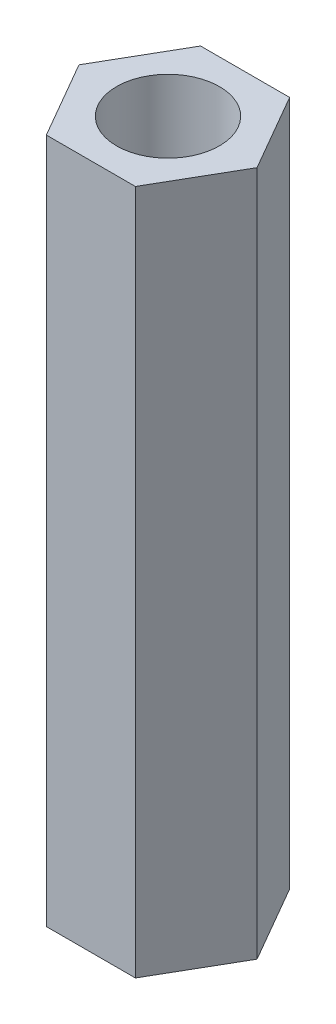
ISO-10303-21;
HEADER;
FILE_DESCRIPTION(('STEP AP214'),'2;1');
FILE_NAME('part.step','',(''),(''),'','','');
FILE_SCHEMA(('AUTOMOTIVE_DESIGN { 1 0 10303 214 1 1 1 1 }'));
ENDSEC;
DATA;
#1=APPLICATION_CONTEXT('core data for automotive mechanical design processes');
#2=APPLICATION_PROTOCOL_DEFINITION('international standard','automotive_design',2000,#1);
#3=PRODUCT_CONTEXT('',#1,'mechanical');
#4=PRODUCT('Part','Part','',(#3));
#5=PRODUCT_RELATED_PRODUCT_CATEGORY('part','',(#4));
#6=PRODUCT_DEFINITION_FORMATION('','',#4);
#7=PRODUCT_DEFINITION_CONTEXT('part definition',#1,'design');
#8=PRODUCT_DEFINITION('design','',#6,#7);
#9=PRODUCT_DEFINITION_SHAPE('','',#8);
#10=(LENGTH_UNIT() NAMED_UNIT(*) SI_UNIT(.MILLI.,.METRE.));
#11=(NAMED_UNIT(*) PLANE_ANGLE_UNIT() SI_UNIT($,.RADIAN.));
#12=(NAMED_UNIT(*) SI_UNIT($,.STERADIAN.) SOLID_ANGLE_UNIT());
#13=UNCERTAINTY_MEASURE_WITH_UNIT(LENGTH_MEASURE(1.E-05),#10,'distance_accuracy_value','');
#14=(GEOMETRIC_REPRESENTATION_CONTEXT(3) GLOBAL_UNCERTAINTY_ASSIGNED_CONTEXT((#13)) GLOBAL_UNIT_ASSIGNED_CONTEXT((#10,
#11,#12)) REPRESENTATION_CONTEXT('',''));
#15=CARTESIAN_POINT('',(0.,0.,0.));
#16=DIRECTION('',(0.,0.,1.));
#17=DIRECTION('',(1.,0.,0.));
#18=AXIS2_PLACEMENT_3D('',#15,#16,#17);
#19=CARTESIAN_POINT('',(0.,20.,0.));
#20=DIRECTION('',(0.,1.,0.));
#21=DIRECTION('',(0.,0.,1.));
#22=AXIS2_PLACEMENT_3D('',#19,#20,#21);
#23=PLANE('',#22);
#24=DIRECTION('',(0.499999999999999,0.,-0.866025403784439));
#25=VECTOR('',#24,1.);
#26=CARTESIAN_POINT('',(1.29903810567665,20.,2.25000000000002));
#27=LINE('',#26,#25);
#28=CARTESIAN_POINT('',(1.29903810567665,20.,2.25000000000002));
#29=VERTEX_POINT('',#28);
#30=CARTESIAN_POINT('',(2.59807621135332,20.,0.));
#31=VERTEX_POINT('',#30);
#32=EDGE_CURVE('E128',#29,#31,#27,.T.);
#33=ORIENTED_EDGE('',*,*,#32,.T.);
#34=DIRECTION('',(-0.5,0.,-0.866025403784438));
#35=VECTOR('',#34,1.);
#36=CARTESIAN_POINT('',(2.59807621135332,20.,0.));
#37=LINE('',#36,#35);
#38=CARTESIAN_POINT('',(1.29903810567665,20.,-2.25000000000002));
#39=VERTEX_POINT('',#38);
#40=EDGE_CURVE('E86',#31,#39,#37,.T.);
#41=ORIENTED_EDGE('',*,*,#40,.T.);
#42=DIRECTION('',(-1.,0.,0.));
#43=VECTOR('',#42,1.);
#44=CARTESIAN_POINT('',(1.29903810567665,20.,-2.25000000000002));
#45=LINE('',#44,#43);
#46=CARTESIAN_POINT('',(-1.29903810567667,20.,-2.25000000000002));
#47=VERTEX_POINT('',#46);
#48=EDGE_CURVE('E99',#39,#47,#45,.T.);
#49=ORIENTED_EDGE('',*,*,#48,.T.);
#50=DIRECTION('',(-0.5,0.,0.866025403784439));
#51=VECTOR('',#50,1.);
#52=CARTESIAN_POINT('',(-1.29903810567667,20.,-2.25000000000002));
#53=LINE('',#52,#51);
#54=CARTESIAN_POINT('',(-2.59807621135334,20.,0.));
#55=VERTEX_POINT('',#54);
#56=EDGE_CURVE('E93',#47,#55,#53,.T.);
#57=ORIENTED_EDGE('',*,*,#56,.T.);
#58=DIRECTION('',(0.5,0.,0.866025403784439));
#59=VECTOR('',#58,1.);
#60=CARTESIAN_POINT('',(-2.59807621135334,20.,0.));
#61=LINE('',#60,#59);
#62=CARTESIAN_POINT('',(-1.29903810567667,20.,2.25000000000002));
#63=VERTEX_POINT('',#62);
#64=EDGE_CURVE('E97',#55,#63,#61,.T.);
#65=ORIENTED_EDGE('',*,*,#64,.T.);
#66=DIRECTION('',(1.,0.,0.));
#67=VECTOR('',#66,1.);
#68=CARTESIAN_POINT('',(-1.29903810567667,20.,2.25000000000002));
#69=LINE('',#68,#67);
#70=EDGE_CURVE('E49',#63,#29,#69,.T.);
#71=ORIENTED_EDGE('',*,*,#70,.T.);
#72=EDGE_LOOP('',(#33,#41,#49,#57,#65,#71));
#73=FACE_BOUND('',#72,.T.);
#74=CARTESIAN_POINT('',(0.,20.,0.));
#75=DIRECTION('',(0.,1.,0.));
#76=DIRECTION('',(0.,0.,1.));
#77=AXIS2_PLACEMENT_3D('',#74,#75,#76);
#78=CIRCLE('',#77,1.5);
#79=CARTESIAN_POINT('',(0.,20.,1.5));
#80=VERTEX_POINT('',#79);
#81=EDGE_CURVE('E121',#80,#80,#78,.T.);
#82=ORIENTED_EDGE('',*,*,#81,.F.);
#83=EDGE_LOOP('',(#82));
#84=FACE_BOUND('',#83,.T.);
#85=ADVANCED_FACE('F32',(#73,#84),#23,.T.);
#86=CARTESIAN_POINT('',(0.,0.,0.));
#87=DIRECTION('',(0.,1.,0.));
#88=DIRECTION('',(0.,0.,1.));
#89=AXIS2_PLACEMENT_3D('',#86,#87,#88);
#90=PLANE('',#89);
#91=DIRECTION('',(0.499999999999999,0.,-0.866025403784439));
#92=VECTOR('',#91,1.);
#93=CARTESIAN_POINT('',(1.29903810567665,0.,2.25000000000002));
#94=LINE('',#93,#92);
#95=CARTESIAN_POINT('',(1.29903810567665,0.,2.25000000000002));
#96=VERTEX_POINT('',#95);
#97=CARTESIAN_POINT('',(2.59807621135332,0.,0.));
#98=VERTEX_POINT('',#97);
#99=EDGE_CURVE('E117',#96,#98,#94,.T.);
#100=ORIENTED_EDGE('',*,*,#99,.F.);
#101=DIRECTION('',(1.,0.,0.));
#102=VECTOR('',#101,1.);
#103=CARTESIAN_POINT('',(-1.29903810567667,0.,2.25000000000002));
#104=LINE('',#103,#102);
#105=CARTESIAN_POINT('',(-1.29903810567667,0.,2.25000000000002));
#106=VERTEX_POINT('',#105);
#107=EDGE_CURVE('E78',#106,#96,#104,.T.);
#108=ORIENTED_EDGE('',*,*,#107,.F.);
#109=DIRECTION('',(0.5,0.,0.866025403784439));
#110=VECTOR('',#109,1.);
#111=CARTESIAN_POINT('',(-2.59807621135334,0.,0.));
#112=LINE('',#111,#110);
#113=CARTESIAN_POINT('',(-2.59807621135334,0.,0.));
#114=VERTEX_POINT('',#113);
#115=EDGE_CURVE('E72',#114,#106,#112,.T.);
#116=ORIENTED_EDGE('',*,*,#115,.F.);
#117=DIRECTION('',(-0.5,0.,0.866025403784439));
#118=VECTOR('',#117,1.);
#119=CARTESIAN_POINT('',(-1.29903810567667,0.,-2.25000000000002));
#120=LINE('',#119,#118);
#121=CARTESIAN_POINT('',(-1.29903810567667,0.,-2.25000000000002));
#122=VERTEX_POINT('',#121);
#123=EDGE_CURVE('E107',#122,#114,#120,.T.);
#124=ORIENTED_EDGE('',*,*,#123,.F.);
#125=DIRECTION('',(-1.,0.,0.));
#126=VECTOR('',#125,1.);
#127=CARTESIAN_POINT('',(1.29903810567665,0.,-2.25000000000002));
#128=LINE('',#127,#126);
#129=CARTESIAN_POINT('',(1.29903810567665,0.,-2.25000000000002));
#130=VERTEX_POINT('',#129);
#131=EDGE_CURVE('E123',#130,#122,#128,.T.);
#132=ORIENTED_EDGE('',*,*,#131,.F.);
#133=DIRECTION('',(-0.5,0.,-0.866025403784438));
#134=VECTOR('',#133,1.);
#135=CARTESIAN_POINT('',(2.59807621135332,0.,0.));
#136=LINE('',#135,#134);
#137=EDGE_CURVE('E120',#98,#130,#136,.T.);
#138=ORIENTED_EDGE('',*,*,#137,.F.);
#139=EDGE_LOOP('',(#100,#108,#116,#124,#132,#138));
#140=FACE_BOUND('',#139,.T.);
#141=CARTESIAN_POINT('',(0.,0.,0.));
#142=DIRECTION('',(0.,1.,0.));
#143=DIRECTION('',(0.,0.,1.));
#144=AXIS2_PLACEMENT_3D('',#141,#142,#143);
#145=CIRCLE('',#144,1.5);
#146=CARTESIAN_POINT('',(0.,0.,1.5));
#147=VERTEX_POINT('',#146);
#148=EDGE_CURVE('E221',#147,#147,#145,.T.);
#149=ORIENTED_EDGE('',*,*,#148,.T.);
#150=EDGE_LOOP('',(#149));
#151=FACE_BOUND('',#150,.T.);
#152=ADVANCED_FACE('F137',(#140,#151),#90,.F.);
#153=CARTESIAN_POINT('',(1.29903810567665,20.,2.25000000000002));
#154=DIRECTION('',(-0.866025403784439,0.,-0.499999999999999));
#155=DIRECTION('',(-0.499999999999999,0.,0.866025403784439));
#156=AXIS2_PLACEMENT_3D('',#153,#154,#155);
#157=PLANE('',#156);
#158=ORIENTED_EDGE('',*,*,#99,.T.);
#159=DIRECTION('',(0.,-1.,0.));
#160=VECTOR('',#159,1.);
#161=CARTESIAN_POINT('',(2.59807621135332,20.,0.));
#162=LINE('',#161,#160);
#163=EDGE_CURVE('E11',#31,#98,#162,.T.);
#164=ORIENTED_EDGE('',*,*,#163,.F.);
#165=ORIENTED_EDGE('',*,*,#32,.F.);
#166=DIRECTION('',(0.,-1.,0.));
#167=VECTOR('',#166,1.);
#168=CARTESIAN_POINT('',(1.29903810567665,20.,2.25000000000002));
#169=LINE('',#168,#167);
#170=EDGE_CURVE('E113',#29,#96,#169,.T.);
#171=ORIENTED_EDGE('',*,*,#170,.T.);
#172=EDGE_LOOP('',(#158,#164,#165,#171));
#173=FACE_BOUND('',#172,.T.);
#174=ADVANCED_FACE('F34',(#173),#157,.F.);
#175=CARTESIAN_POINT('',(2.59807621135332,20.,0.));
#176=DIRECTION('',(-0.866025403784438,0.,0.5));
#177=DIRECTION('',(0.5,0.,0.866025403784438));
#178=AXIS2_PLACEMENT_3D('',#175,#176,#177);
#179=PLANE('',#178);
#180=ORIENTED_EDGE('',*,*,#137,.T.);
#181=DIRECTION('',(0.,-1.,0.));
#182=VECTOR('',#181,1.);
#183=CARTESIAN_POINT('',(1.29903810567665,20.,-2.25000000000002));
#184=LINE('',#183,#182);
#185=EDGE_CURVE('E41',#39,#130,#184,.T.);
#186=ORIENTED_EDGE('',*,*,#185,.F.);
#187=ORIENTED_EDGE('',*,*,#40,.F.);
#188=ORIENTED_EDGE('',*,*,#163,.T.);
#189=EDGE_LOOP('',(#180,#186,#187,#188));
#190=FACE_BOUND('',#189,.T.);
#191=ADVANCED_FACE('F162',(#190),#179,.F.);
#192=CARTESIAN_POINT('',(1.29903810567665,20.,-2.25000000000002));
#193=DIRECTION('',(0.,0.,1.));
#194=DIRECTION('',(1.,0.,0.));
#195=AXIS2_PLACEMENT_3D('',#192,#193,#194);
#196=PLANE('',#195);
#197=ORIENTED_EDGE('',*,*,#131,.T.);
#198=DIRECTION('',(0.,-1.,0.));
#199=VECTOR('',#198,1.);
#200=CARTESIAN_POINT('',(-1.29903810567667,20.,-2.25000000000002));
#201=LINE('',#200,#199);
#202=EDGE_CURVE('E108',#47,#122,#201,.T.);
#203=ORIENTED_EDGE('',*,*,#202,.F.);
#204=ORIENTED_EDGE('',*,*,#48,.F.);
#205=ORIENTED_EDGE('',*,*,#185,.T.);
#206=EDGE_LOOP('',(#197,#203,#204,#205));
#207=FACE_BOUND('',#206,.T.);
#208=ADVANCED_FACE('F134',(#207),#196,.F.);
#209=CARTESIAN_POINT('',(-1.29903810567667,20.,-2.25000000000002));
#210=DIRECTION('',(0.866025403784439,0.,0.5));
#211=DIRECTION('',(0.5,0.,-0.866025403784439));
#212=AXIS2_PLACEMENT_3D('',#209,#210,#211);
#213=PLANE('',#212);
#214=ORIENTED_EDGE('',*,*,#123,.T.);
#215=DIRECTION('',(0.,-1.,0.));
#216=VECTOR('',#215,1.);
#217=CARTESIAN_POINT('',(-2.59807621135334,20.,0.));
#218=LINE('',#217,#216);
#219=EDGE_CURVE('E104',#55,#114,#218,.T.);
#220=ORIENTED_EDGE('',*,*,#219,.F.);
#221=ORIENTED_EDGE('',*,*,#56,.F.);
#222=ORIENTED_EDGE('',*,*,#202,.T.);
#223=EDGE_LOOP('',(#214,#220,#221,#222));
#224=FACE_BOUND('',#223,.T.);
#225=ADVANCED_FACE('F105',(#224),#213,.F.);
#226=CARTESIAN_POINT('',(-2.59807621135334,20.,0.));
#227=DIRECTION('',(0.866025403784439,0.,-0.5));
#228=DIRECTION('',(-0.5,0.,-0.866025403784439));
#229=AXIS2_PLACEMENT_3D('',#226,#227,#228);
#230=PLANE('',#229);
#231=ORIENTED_EDGE('',*,*,#115,.T.);
#232=DIRECTION('',(0.,-1.,0.));
#233=VECTOR('',#232,1.);
#234=CARTESIAN_POINT('',(-1.29903810567667,20.,2.25000000000002));
#235=LINE('',#234,#233);
#236=EDGE_CURVE('E109',#63,#106,#235,.T.);
#237=ORIENTED_EDGE('',*,*,#236,.F.);
#238=ORIENTED_EDGE('',*,*,#64,.F.);
#239=ORIENTED_EDGE('',*,*,#219,.T.);
#240=EDGE_LOOP('',(#231,#237,#238,#239));
#241=FACE_BOUND('',#240,.T.);
#242=ADVANCED_FACE('F111',(#241),#230,.F.);
#243=CARTESIAN_POINT('',(-1.29903810567667,20.,2.25000000000002));
#244=DIRECTION('',(0.,0.,-1.));
#245=DIRECTION('',(-1.,0.,0.));
#246=AXIS2_PLACEMENT_3D('',#243,#244,#245);
#247=PLANE('',#246);
#248=ORIENTED_EDGE('',*,*,#107,.T.);
#249=ORIENTED_EDGE('',*,*,#170,.F.);
#250=ORIENTED_EDGE('',*,*,#70,.F.);
#251=ORIENTED_EDGE('',*,*,#236,.T.);
#252=EDGE_LOOP('',(#248,#249,#250,#251));
#253=FACE_BOUND('',#252,.T.);
#254=ADVANCED_FACE('F142',(#253),#247,.F.);
#255=CARTESIAN_POINT('',(0.,20.,0.));
#256=DIRECTION('',(0.,-1.,0.));
#257=DIRECTION('',(0.,0.,-1.));
#258=AXIS2_PLACEMENT_3D('',#255,#256,#257);
#259=CYLINDRICAL_SURFACE('',#258,1.5);
#260=ORIENTED_EDGE('',*,*,#81,.T.);
#261=EDGE_LOOP('',(#260));
#262=FACE_BOUND('',#261,.T.);
#263=ORIENTED_EDGE('',*,*,#148,.F.);
#264=EDGE_LOOP('',(#263));
#265=FACE_BOUND('',#264,.T.);
#266=ADVANCED_FACE('F144',(#262,#265),#259,.F.);
#267=CLOSED_SHELL('',(#85,#152,#174,#191,#208,#225,#242,#254,#266));
#268=MANIFOLD_SOLID_BREP('B2',#267);
#269=ADVANCED_BREP_SHAPE_REPRESENTATION('',(#18,#268),#14);
#270=SHAPE_DEFINITION_REPRESENTATION(#9,#269);
ENDSEC;
END-ISO-10303-21;
